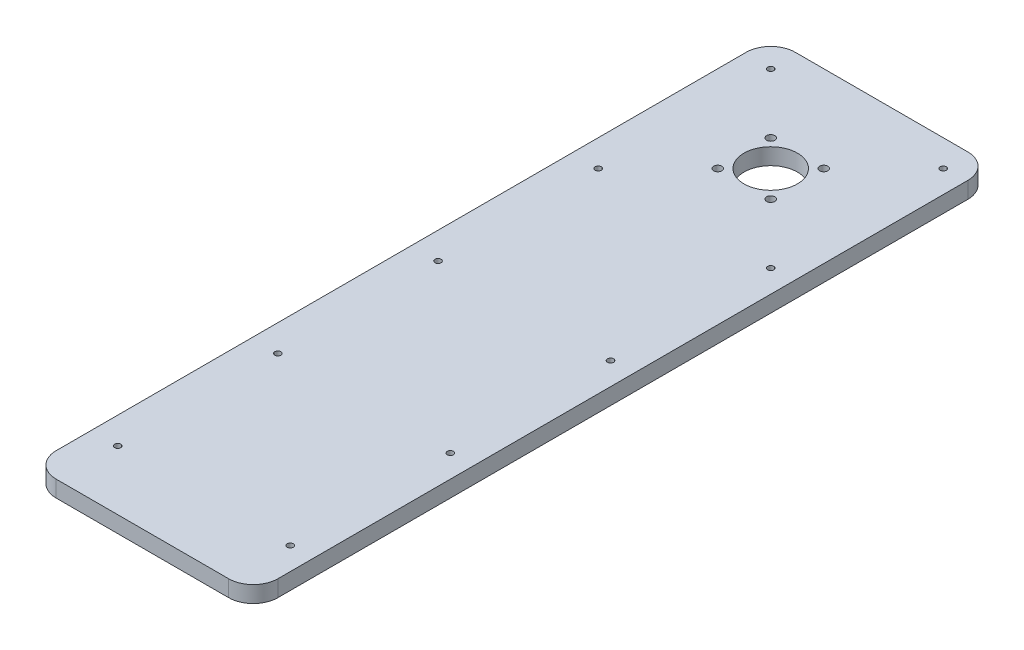
ISO-10303-21;
HEADER;
FILE_DESCRIPTION(('STEP AP214'),'2;1');
FILE_NAME('part.step','',(''),(''),'','','');
FILE_SCHEMA(('AUTOMOTIVE_DESIGN { 1 0 10303 214 1 1 1 1 }'));
ENDSEC;
DATA;
#1=APPLICATION_CONTEXT('core data for automotive mechanical design processes');
#2=APPLICATION_PROTOCOL_DEFINITION('international standard','automotive_design',2000,#1);
#3=PRODUCT_CONTEXT('',#1,'mechanical');
#4=PRODUCT('Part','Part','',(#3));
#5=PRODUCT_RELATED_PRODUCT_CATEGORY('part','',(#4));
#6=PRODUCT_DEFINITION_FORMATION('','',#4);
#7=PRODUCT_DEFINITION_CONTEXT('part definition',#1,'design');
#8=PRODUCT_DEFINITION('design','',#6,#7);
#9=PRODUCT_DEFINITION_SHAPE('','',#8);
#10=(LENGTH_UNIT() NAMED_UNIT(*) SI_UNIT(.MILLI.,.METRE.));
#11=(NAMED_UNIT(*) PLANE_ANGLE_UNIT() SI_UNIT($,.RADIAN.));
#12=(NAMED_UNIT(*) SI_UNIT($,.STERADIAN.) SOLID_ANGLE_UNIT());
#13=UNCERTAINTY_MEASURE_WITH_UNIT(LENGTH_MEASURE(1.E-05),#10,'distance_accuracy_value','');
#14=(GEOMETRIC_REPRESENTATION_CONTEXT(3) GLOBAL_UNCERTAINTY_ASSIGNED_CONTEXT((#13)) GLOBAL_UNIT_ASSIGNED_CONTEXT((#10,
#11,#12)) REPRESENTATION_CONTEXT('',''));
#15=CARTESIAN_POINT('',(0.,0.,0.));
#16=DIRECTION('',(0.,0.,1.));
#17=DIRECTION('',(1.,0.,0.));
#18=AXIS2_PLACEMENT_3D('',#15,#16,#17);
#19=CARTESIAN_POINT('',(0.,8.,0.));
#20=DIRECTION('',(0.,-1.,0.));
#21=DIRECTION('',(0.,0.,-1.));
#22=AXIS2_PLACEMENT_3D('',#19,#20,#21);
#23=PLANE('',#22);
#24=DIRECTION('',(0.,0.,-1.));
#25=VECTOR('',#24,1.);
#26=CARTESIAN_POINT('',(53.,8.,180.));
#27=LINE('',#26,#25);
#28=CARTESIAN_POINT('',(53.,8.,168.));
#29=VERTEX_POINT('',#28);
#30=CARTESIAN_POINT('',(53.,8.,-168.));
#31=VERTEX_POINT('',#30);
#32=EDGE_CURVE('E140',#29,#31,#27,.T.);
#33=ORIENTED_EDGE('',*,*,#32,.T.);
#34=CARTESIAN_POINT('',(41.,8.,-168.));
#35=DIRECTION('',(0.,-1.,0.));
#36=DIRECTION('',(0.,0.,-1.));
#37=AXIS2_PLACEMENT_3D('',#34,#35,#36);
#38=CIRCLE('',#37,12.);
#39=CARTESIAN_POINT('',(41.,8.,-180.));
#40=VERTEX_POINT('',#39);
#41=EDGE_CURVE('E155',#31,#40,#38,.F.);
#42=ORIENTED_EDGE('',*,*,#41,.T.);
#43=DIRECTION('',(-1.,0.,0.));
#44=VECTOR('',#43,1.);
#45=CARTESIAN_POINT('',(-55.,8.,-180.));
#46=LINE('',#45,#44);
#47=CARTESIAN_POINT('',(-43.,8.,-180.));
#48=VERTEX_POINT('',#47);
#49=EDGE_CURVE('E122',#40,#48,#46,.T.);
#50=ORIENTED_EDGE('',*,*,#49,.T.);
#51=CARTESIAN_POINT('',(-43.,8.,-168.));
#52=DIRECTION('',(0.,-1.,0.));
#53=DIRECTION('',(0.,0.,-1.));
#54=AXIS2_PLACEMENT_3D('',#51,#52,#53);
#55=CIRCLE('',#54,12.);
#56=CARTESIAN_POINT('',(-55.,8.,-168.));
#57=VERTEX_POINT('',#56);
#58=EDGE_CURVE('E153',#48,#57,#55,.F.);
#59=ORIENTED_EDGE('',*,*,#58,.T.);
#60=DIRECTION('',(0.,0.,1.));
#61=VECTOR('',#60,1.);
#62=CARTESIAN_POINT('',(-55.,8.,180.));
#63=LINE('',#62,#61);
#64=CARTESIAN_POINT('',(-55.,8.,168.));
#65=VERTEX_POINT('',#64);
#66=EDGE_CURVE('E175',#57,#65,#63,.T.);
#67=ORIENTED_EDGE('',*,*,#66,.T.);
#68=CARTESIAN_POINT('',(-43.,8.,168.));
#69=DIRECTION('',(0.,-1.,0.));
#70=DIRECTION('',(0.,0.,-1.));
#71=AXIS2_PLACEMENT_3D('',#68,#69,#70);
#72=CIRCLE('',#71,12.);
#73=CARTESIAN_POINT('',(-43.,8.,180.));
#74=VERTEX_POINT('',#73);
#75=EDGE_CURVE('E57',#65,#74,#72,.F.);
#76=ORIENTED_EDGE('',*,*,#75,.T.);
#77=DIRECTION('',(1.,0.,0.));
#78=VECTOR('',#77,1.);
#79=CARTESIAN_POINT('',(-55.,8.,180.));
#80=LINE('',#79,#78);
#81=CARTESIAN_POINT('',(41.,8.,180.));
#82=VERTEX_POINT('',#81);
#83=EDGE_CURVE('E141',#74,#82,#80,.T.);
#84=ORIENTED_EDGE('',*,*,#83,.T.);
#85=CARTESIAN_POINT('',(41.,8.,168.));
#86=DIRECTION('',(0.,-1.,0.));
#87=DIRECTION('',(0.,0.,-1.));
#88=AXIS2_PLACEMENT_3D('',#85,#86,#87);
#89=CIRCLE('',#88,12.);
#90=EDGE_CURVE('E151',#82,#29,#89,.F.);
#91=ORIENTED_EDGE('',*,*,#90,.T.);
#92=EDGE_LOOP('',(#33,#42,#50,#59,#67,#76,#84,#91));
#93=FACE_BOUND('',#92,.T.);
#94=CARTESIAN_POINT('',(0.,8.,-125.));
#95=DIRECTION('',(0.,1.,0.));
#96=DIRECTION('',(0.,0.,1.));
#97=AXIS2_PLACEMENT_3D('',#94,#95,#96);
#98=CIRCLE('',#97,13.);
#99=CARTESIAN_POINT('',(0.,8.,-112.));
#100=VERTEX_POINT('',#99);
#101=EDGE_CURVE('E135',#100,#100,#98,.T.);
#102=ORIENTED_EDGE('',*,*,#101,.F.);
#103=EDGE_LOOP('',(#102));
#104=FACE_BOUND('',#103,.T.);
#105=CARTESIAN_POINT('',(-41.9999999999999,8.,-4.99999999999999));
#106=DIRECTION('',(0.,1.,0.));
#107=DIRECTION('',(0.,0.,1.));
#108=AXIS2_PLACEMENT_3D('',#105,#106,#107);
#109=CIRCLE('',#108,1.5);
#110=CARTESIAN_POINT('',(-41.9999999999999,8.,-3.49999999999999));
#111=VERTEX_POINT('',#110);
#112=EDGE_CURVE('E190',#111,#111,#109,.T.);
#113=ORIENTED_EDGE('',*,*,#112,.F.);
#114=EDGE_LOOP('',(#113));
#115=FACE_BOUND('',#114,.T.);
#116=CARTESIAN_POINT('',(-41.9999999999999,8.,73.));
#117=DIRECTION('',(0.,1.,0.));
#118=DIRECTION('',(0.,0.,1.));
#119=AXIS2_PLACEMENT_3D('',#116,#117,#118);
#120=CIRCLE('',#119,1.5);
#121=CARTESIAN_POINT('',(-41.9999999999999,8.,74.5));
#122=VERTEX_POINT('',#121);
#123=EDGE_CURVE('E194',#122,#122,#120,.T.);
#124=ORIENTED_EDGE('',*,*,#123,.F.);
#125=EDGE_LOOP('',(#124));
#126=FACE_BOUND('',#125,.T.);
#127=CARTESIAN_POINT('',(-41.9999999999999,8.,151.));
#128=DIRECTION('',(0.,1.,0.));
#129=DIRECTION('',(0.,0.,1.));
#130=AXIS2_PLACEMENT_3D('',#127,#128,#129);
#131=CIRCLE('',#130,1.5);
#132=CARTESIAN_POINT('',(-41.9999999999999,8.,152.5));
#133=VERTEX_POINT('',#132);
#134=EDGE_CURVE('E198',#133,#133,#131,.T.);
#135=ORIENTED_EDGE('',*,*,#134,.F.);
#136=EDGE_LOOP('',(#135));
#137=FACE_BOUND('',#136,.T.);
#138=CARTESIAN_POINT('',(-42.,8.,-83.));
#139=DIRECTION('',(0.,1.,0.));
#140=DIRECTION('',(0.,0.,1.));
#141=AXIS2_PLACEMENT_3D('',#138,#139,#140);
#142=CIRCLE('',#141,1.5);
#143=CARTESIAN_POINT('',(-42.,8.,-81.5));
#144=VERTEX_POINT('',#143);
#145=EDGE_CURVE('E202',#144,#144,#142,.T.);
#146=ORIENTED_EDGE('',*,*,#145,.F.);
#147=EDGE_LOOP('',(#146));
#148=FACE_BOUND('',#147,.T.);
#149=CARTESIAN_POINT('',(-12.9046987566544,8.,-112.095301243345));
#150=DIRECTION('',(0.,1.,0.));
#151=DIRECTION('',(0.,0.,1.));
#152=AXIS2_PLACEMENT_3D('',#149,#150,#151);
#153=CIRCLE('',#152,2.);
#154=CARTESIAN_POINT('',(-12.9046987566544,8.,-110.095301243345));
#155=VERTEX_POINT('',#154);
#156=EDGE_CURVE('E206',#155,#155,#153,.T.);
#157=ORIENTED_EDGE('',*,*,#156,.F.);
#158=EDGE_LOOP('',(#157));
#159=FACE_BOUND('',#158,.T.);
#160=CARTESIAN_POINT('',(-42.,8.,-167.));
#161=DIRECTION('',(0.,1.,0.));
#162=DIRECTION('',(0.,0.,1.));
#163=AXIS2_PLACEMENT_3D('',#160,#161,#162);
#164=CIRCLE('',#163,1.5);
#165=CARTESIAN_POINT('',(-42.,8.,-165.5));
#166=VERTEX_POINT('',#165);
#167=EDGE_CURVE('E210',#166,#166,#164,.T.);
#168=ORIENTED_EDGE('',*,*,#167,.F.);
#169=EDGE_LOOP('',(#168));
#170=FACE_BOUND('',#169,.T.);
#171=CARTESIAN_POINT('',(42.,8.,-167.));
#172=DIRECTION('',(0.,1.,0.));
#173=DIRECTION('',(0.,0.,1.));
#174=AXIS2_PLACEMENT_3D('',#171,#172,#173);
#175=CIRCLE('',#174,1.5);
#176=CARTESIAN_POINT('',(42.,8.,-165.5));
#177=VERTEX_POINT('',#176);
#178=EDGE_CURVE('E214',#177,#177,#175,.T.);
#179=ORIENTED_EDGE('',*,*,#178,.F.);
#180=EDGE_LOOP('',(#179));
#181=FACE_BOUND('',#180,.T.);
#182=CARTESIAN_POINT('',(42.,8.,-83.));
#183=DIRECTION('',(0.,1.,0.));
#184=DIRECTION('',(0.,0.,1.));
#185=AXIS2_PLACEMENT_3D('',#182,#183,#184);
#186=CIRCLE('',#185,1.5);
#187=CARTESIAN_POINT('',(42.,8.,-81.5));
#188=VERTEX_POINT('',#187);
#189=EDGE_CURVE('E218',#188,#188,#186,.T.);
#190=ORIENTED_EDGE('',*,*,#189,.F.);
#191=EDGE_LOOP('',(#190));
#192=FACE_BOUND('',#191,.T.);
#193=CARTESIAN_POINT('',(42.,8.,151.));
#194=DIRECTION('',(0.,1.,0.));
#195=DIRECTION('',(0.,0.,-1.));
#196=AXIS2_PLACEMENT_3D('',#193,#194,#195);
#197=CIRCLE('',#196,1.5);
#198=CARTESIAN_POINT('',(42.,8.,149.5));
#199=VERTEX_POINT('',#198);
#200=EDGE_CURVE('E222',#199,#199,#197,.T.);
#201=ORIENTED_EDGE('',*,*,#200,.F.);
#202=EDGE_LOOP('',(#201));
#203=FACE_BOUND('',#202,.T.);
#204=CARTESIAN_POINT('',(-12.9046987566546,8.,-137.904698756654));
#205=DIRECTION('',(0.,1.,0.));
#206=DIRECTION('',(0.,0.,1.));
#207=AXIS2_PLACEMENT_3D('',#204,#205,#206);
#208=CIRCLE('',#207,2.00000000000001);
#209=CARTESIAN_POINT('',(-12.9046987566546,8.,-135.904698756654));
#210=VERTEX_POINT('',#209);
#211=EDGE_CURVE('E226',#210,#210,#208,.T.);
#212=ORIENTED_EDGE('',*,*,#211,.F.);
#213=EDGE_LOOP('',(#212));
#214=FACE_BOUND('',#213,.T.);
#215=CARTESIAN_POINT('',(12.9046987566544,8.,-137.904698756655));
#216=DIRECTION('',(0.,1.,0.));
#217=DIRECTION('',(0.,0.,1.));
#218=AXIS2_PLACEMENT_3D('',#215,#216,#217);
#219=CIRCLE('',#218,2.);
#220=CARTESIAN_POINT('',(12.9046987566544,8.,-135.904698756655));
#221=VERTEX_POINT('',#220);
#222=EDGE_CURVE('E230',#221,#221,#219,.T.);
#223=ORIENTED_EDGE('',*,*,#222,.F.);
#224=EDGE_LOOP('',(#223));
#225=FACE_BOUND('',#224,.T.);
#226=CARTESIAN_POINT('',(12.9046987566546,8.,-112.095301243346));
#227=DIRECTION('',(0.,1.,0.));
#228=DIRECTION('',(0.,0.,1.));
#229=AXIS2_PLACEMENT_3D('',#226,#227,#228);
#230=CIRCLE('',#229,2.00000000000001);
#231=CARTESIAN_POINT('',(12.9046987566546,8.,-110.095301243346));
#232=VERTEX_POINT('',#231);
#233=EDGE_CURVE('E234',#232,#232,#230,.T.);
#234=ORIENTED_EDGE('',*,*,#233,.F.);
#235=EDGE_LOOP('',(#234));
#236=FACE_BOUND('',#235,.T.);
#237=CARTESIAN_POINT('',(42.,8.,72.9999999999998));
#238=DIRECTION('',(0.,1.,0.));
#239=DIRECTION('',(0.,0.,-1.));
#240=AXIS2_PLACEMENT_3D('',#237,#238,#239);
#241=CIRCLE('',#240,1.5);
#242=CARTESIAN_POINT('',(42.,8.,71.4999999999998));
#243=VERTEX_POINT('',#242);
#244=EDGE_CURVE('E238',#243,#243,#241,.T.);
#245=ORIENTED_EDGE('',*,*,#244,.F.);
#246=EDGE_LOOP('',(#245));
#247=FACE_BOUND('',#246,.T.);
#248=CARTESIAN_POINT('',(42.,8.,-5.0000000000001));
#249=DIRECTION('',(0.,1.,0.));
#250=DIRECTION('',(0.,0.,-1.));
#251=AXIS2_PLACEMENT_3D('',#248,#249,#250);
#252=CIRCLE('',#251,1.5);
#253=CARTESIAN_POINT('',(42.,8.,-6.50000000000011));
#254=VERTEX_POINT('',#253);
#255=EDGE_CURVE('E241',#254,#254,#252,.T.);
#256=ORIENTED_EDGE('',*,*,#255,.F.);
#257=EDGE_LOOP('',(#256));
#258=FACE_BOUND('',#257,.T.);
#259=ADVANCED_FACE('F37',(#93,#104,#115,#126,#137,#148,#159,#170,#181,#192,#203,#214,#225,#236,
#247,#258),#23,.F.);
#260=CARTESIAN_POINT('',(0.,0.,0.));
#261=DIRECTION('',(0.,-1.,0.));
#262=DIRECTION('',(0.,0.,-1.));
#263=AXIS2_PLACEMENT_3D('',#260,#261,#262);
#264=PLANE('',#263);
#265=CARTESIAN_POINT('',(42.,0.,72.9999999999998));
#266=DIRECTION('',(0.,1.,0.));
#267=DIRECTION('',(0.,0.,-1.));
#268=AXIS2_PLACEMENT_3D('',#265,#266,#267);
#269=CIRCLE('',#268,1.5);
#270=CARTESIAN_POINT('',(42.,0.,71.4999999999998));
#271=VERTEX_POINT('',#270);
#272=EDGE_CURVE('E243',#271,#271,#269,.T.);
#273=ORIENTED_EDGE('',*,*,#272,.T.);
#274=EDGE_LOOP('',(#273));
#275=FACE_BOUND('',#274,.T.);
#276=CARTESIAN_POINT('',(12.9046987566544,0.,-137.904698756655));
#277=DIRECTION('',(0.,1.,0.));
#278=DIRECTION('',(0.,0.,1.));
#279=AXIS2_PLACEMENT_3D('',#276,#277,#278);
#280=CIRCLE('',#279,2.);
#281=CARTESIAN_POINT('',(12.9046987566544,0.,-135.904698756655));
#282=VERTEX_POINT('',#281);
#283=EDGE_CURVE('E254',#282,#282,#280,.T.);
#284=ORIENTED_EDGE('',*,*,#283,.T.);
#285=EDGE_LOOP('',(#284));
#286=FACE_BOUND('',#285,.T.);
#287=CARTESIAN_POINT('',(42.,0.,151.));
#288=DIRECTION('',(0.,1.,0.));
#289=DIRECTION('',(0.,0.,-1.));
#290=AXIS2_PLACEMENT_3D('',#287,#288,#289);
#291=CIRCLE('',#290,1.5);
#292=CARTESIAN_POINT('',(42.,0.,149.5));
#293=VERTEX_POINT('',#292);
#294=EDGE_CURVE('E262',#293,#293,#291,.T.);
#295=ORIENTED_EDGE('',*,*,#294,.T.);
#296=EDGE_LOOP('',(#295));
#297=FACE_BOUND('',#296,.T.);
#298=CARTESIAN_POINT('',(42.,0.,-167.));
#299=DIRECTION('',(0.,1.,0.));
#300=DIRECTION('',(0.,0.,1.));
#301=AXIS2_PLACEMENT_3D('',#298,#299,#300);
#302=CIRCLE('',#301,1.5);
#303=CARTESIAN_POINT('',(42.,0.,-165.5));
#304=VERTEX_POINT('',#303);
#305=EDGE_CURVE('E270',#304,#304,#302,.T.);
#306=ORIENTED_EDGE('',*,*,#305,.T.);
#307=EDGE_LOOP('',(#306));
#308=FACE_BOUND('',#307,.T.);
#309=CARTESIAN_POINT('',(-12.9046987566544,0.,-112.095301243345));
#310=DIRECTION('',(0.,1.,0.));
#311=DIRECTION('',(0.,0.,1.));
#312=AXIS2_PLACEMENT_3D('',#309,#310,#311);
#313=CIRCLE('',#312,2.);
#314=CARTESIAN_POINT('',(-12.9046987566544,0.,-110.095301243345));
#315=VERTEX_POINT('',#314);
#316=EDGE_CURVE('E278',#315,#315,#313,.T.);
#317=ORIENTED_EDGE('',*,*,#316,.T.);
#318=EDGE_LOOP('',(#317));
#319=FACE_BOUND('',#318,.T.);
#320=CARTESIAN_POINT('',(-41.9999999999999,0.,151.));
#321=DIRECTION('',(0.,1.,0.));
#322=DIRECTION('',(0.,0.,1.));
#323=AXIS2_PLACEMENT_3D('',#320,#321,#322);
#324=CIRCLE('',#323,1.5);
#325=CARTESIAN_POINT('',(-41.9999999999999,0.,152.5));
#326=VERTEX_POINT('',#325);
#327=EDGE_CURVE('E286',#326,#326,#324,.T.);
#328=ORIENTED_EDGE('',*,*,#327,.T.);
#329=EDGE_LOOP('',(#328));
#330=FACE_BOUND('',#329,.T.);
#331=CARTESIAN_POINT('',(-41.9999999999999,0.,-4.99999999999999));
#332=DIRECTION('',(0.,1.,0.));
#333=DIRECTION('',(0.,0.,1.));
#334=AXIS2_PLACEMENT_3D('',#331,#332,#333);
#335=CIRCLE('',#334,1.5);
#336=CARTESIAN_POINT('',(-41.9999999999999,0.,-3.49999999999999));
#337=VERTEX_POINT('',#336);
#338=EDGE_CURVE('E294',#337,#337,#335,.T.);
#339=ORIENTED_EDGE('',*,*,#338,.T.);
#340=EDGE_LOOP('',(#339));
#341=FACE_BOUND('',#340,.T.);
#342=DIRECTION('',(-1.,0.,0.));
#343=VECTOR('',#342,1.);
#344=CARTESIAN_POINT('',(-55.,0.,-180.));
#345=LINE('',#344,#343);
#346=CARTESIAN_POINT('',(41.,0.,-180.));
#347=VERTEX_POINT('',#346);
#348=CARTESIAN_POINT('',(-43.,0.,-180.));
#349=VERTEX_POINT('',#348);
#350=EDGE_CURVE('E119',#347,#349,#345,.T.);
#351=ORIENTED_EDGE('',*,*,#350,.F.);
#352=CARTESIAN_POINT('',(41.,0.,-168.));
#353=DIRECTION('',(0.,-1.,0.));
#354=DIRECTION('',(0.,0.,-1.));
#355=AXIS2_PLACEMENT_3D('',#352,#353,#354);
#356=CIRCLE('',#355,12.);
#357=CARTESIAN_POINT('',(53.,0.,-168.));
#358=VERTEX_POINT('',#357);
#359=EDGE_CURVE('E102',#347,#358,#356,.T.);
#360=ORIENTED_EDGE('',*,*,#359,.T.);
#361=DIRECTION('',(0.,0.,-1.));
#362=VECTOR('',#361,1.);
#363=CARTESIAN_POINT('',(53.,0.,180.));
#364=LINE('',#363,#362);
#365=CARTESIAN_POINT('',(53.,0.,168.));
#366=VERTEX_POINT('',#365);
#367=EDGE_CURVE('E130',#366,#358,#364,.T.);
#368=ORIENTED_EDGE('',*,*,#367,.F.);
#369=CARTESIAN_POINT('',(41.,0.,168.));
#370=DIRECTION('',(0.,-1.,0.));
#371=DIRECTION('',(0.,0.,-1.));
#372=AXIS2_PLACEMENT_3D('',#369,#370,#371);
#373=CIRCLE('',#372,12.);
#374=CARTESIAN_POINT('',(41.,0.,180.));
#375=VERTEX_POINT('',#374);
#376=EDGE_CURVE('E144',#366,#375,#373,.T.);
#377=ORIENTED_EDGE('',*,*,#376,.T.);
#378=DIRECTION('',(1.,0.,0.));
#379=VECTOR('',#378,1.);
#380=CARTESIAN_POINT('',(-55.,0.,180.));
#381=LINE('',#380,#379);
#382=CARTESIAN_POINT('',(-43.,0.,180.));
#383=VERTEX_POINT('',#382);
#384=EDGE_CURVE('E133',#383,#375,#381,.T.);
#385=ORIENTED_EDGE('',*,*,#384,.F.);
#386=CARTESIAN_POINT('',(-43.,0.,168.));
#387=DIRECTION('',(0.,-1.,0.));
#388=DIRECTION('',(0.,0.,-1.));
#389=AXIS2_PLACEMENT_3D('',#386,#387,#388);
#390=CIRCLE('',#389,12.);
#391=CARTESIAN_POINT('',(-55.,0.,168.));
#392=VERTEX_POINT('',#391);
#393=EDGE_CURVE('E123',#383,#392,#390,.T.);
#394=ORIENTED_EDGE('',*,*,#393,.T.);
#395=DIRECTION('',(0.,0.,1.));
#396=VECTOR('',#395,1.);
#397=CARTESIAN_POINT('',(-55.,0.,180.));
#398=LINE('',#397,#396);
#399=CARTESIAN_POINT('',(-55.,0.,-168.));
#400=VERTEX_POINT('',#399);
#401=EDGE_CURVE('E129',#400,#392,#398,.T.);
#402=ORIENTED_EDGE('',*,*,#401,.F.);
#403=CARTESIAN_POINT('',(-43.,0.,-168.));
#404=DIRECTION('',(0.,-1.,0.));
#405=DIRECTION('',(0.,0.,-1.));
#406=AXIS2_PLACEMENT_3D('',#403,#404,#405);
#407=CIRCLE('',#406,12.);
#408=EDGE_CURVE('E113',#400,#349,#407,.T.);
#409=ORIENTED_EDGE('',*,*,#408,.T.);
#410=EDGE_LOOP('',(#351,#360,#368,#377,#385,#394,#402,#409));
#411=FACE_BOUND('',#410,.T.);
#412=CARTESIAN_POINT('',(0.,0.,-125.));
#413=DIRECTION('',(0.,1.,0.));
#414=DIRECTION('',(0.,0.,1.));
#415=AXIS2_PLACEMENT_3D('',#412,#413,#414);
#416=CIRCLE('',#415,13.);
#417=CARTESIAN_POINT('',(0.,0.,-112.));
#418=VERTEX_POINT('',#417);
#419=EDGE_CURVE('E178',#418,#418,#416,.T.);
#420=ORIENTED_EDGE('',*,*,#419,.T.);
#421=EDGE_LOOP('',(#420));
#422=FACE_BOUND('',#421,.T.);
#423=CARTESIAN_POINT('',(-41.9999999999999,0.,73.));
#424=DIRECTION('',(0.,1.,0.));
#425=DIRECTION('',(0.,0.,1.));
#426=AXIS2_PLACEMENT_3D('',#423,#424,#425);
#427=CIRCLE('',#426,1.5);
#428=CARTESIAN_POINT('',(-41.9999999999999,0.,74.5));
#429=VERTEX_POINT('',#428);
#430=EDGE_CURVE('E290',#429,#429,#427,.T.);
#431=ORIENTED_EDGE('',*,*,#430,.T.);
#432=EDGE_LOOP('',(#431));
#433=FACE_BOUND('',#432,.T.);
#434=CARTESIAN_POINT('',(-42.,0.,-83.));
#435=DIRECTION('',(0.,1.,0.));
#436=DIRECTION('',(0.,0.,1.));
#437=AXIS2_PLACEMENT_3D('',#434,#435,#436);
#438=CIRCLE('',#437,1.5);
#439=CARTESIAN_POINT('',(-42.,0.,-81.5));
#440=VERTEX_POINT('',#439);
#441=EDGE_CURVE('E282',#440,#440,#438,.T.);
#442=ORIENTED_EDGE('',*,*,#441,.T.);
#443=EDGE_LOOP('',(#442));
#444=FACE_BOUND('',#443,.T.);
#445=CARTESIAN_POINT('',(-42.,0.,-167.));
#446=DIRECTION('',(0.,1.,0.));
#447=DIRECTION('',(0.,0.,1.));
#448=AXIS2_PLACEMENT_3D('',#445,#446,#447);
#449=CIRCLE('',#448,1.5);
#450=CARTESIAN_POINT('',(-42.,0.,-165.5));
#451=VERTEX_POINT('',#450);
#452=EDGE_CURVE('E274',#451,#451,#449,.T.);
#453=ORIENTED_EDGE('',*,*,#452,.T.);
#454=EDGE_LOOP('',(#453));
#455=FACE_BOUND('',#454,.T.);
#456=CARTESIAN_POINT('',(42.,0.,-83.));
#457=DIRECTION('',(0.,1.,0.));
#458=DIRECTION('',(0.,0.,1.));
#459=AXIS2_PLACEMENT_3D('',#456,#457,#458);
#460=CIRCLE('',#459,1.5);
#461=CARTESIAN_POINT('',(42.,0.,-81.5));
#462=VERTEX_POINT('',#461);
#463=EDGE_CURVE('E266',#462,#462,#460,.T.);
#464=ORIENTED_EDGE('',*,*,#463,.T.);
#465=EDGE_LOOP('',(#464));
#466=FACE_BOUND('',#465,.T.);
#467=CARTESIAN_POINT('',(-12.9046987566546,0.,-137.904698756654));
#468=DIRECTION('',(0.,1.,0.));
#469=DIRECTION('',(0.,0.,1.));
#470=AXIS2_PLACEMENT_3D('',#467,#468,#469);
#471=CIRCLE('',#470,2.00000000000001);
#472=CARTESIAN_POINT('',(-12.9046987566546,0.,-135.904698756654));
#473=VERTEX_POINT('',#472);
#474=EDGE_CURVE('E258',#473,#473,#471,.T.);
#475=ORIENTED_EDGE('',*,*,#474,.T.);
#476=EDGE_LOOP('',(#475));
#477=FACE_BOUND('',#476,.T.);
#478=CARTESIAN_POINT('',(12.9046987566546,0.,-112.095301243346));
#479=DIRECTION('',(0.,1.,0.));
#480=DIRECTION('',(0.,0.,1.));
#481=AXIS2_PLACEMENT_3D('',#478,#479,#480);
#482=CIRCLE('',#481,2.00000000000001);
#483=CARTESIAN_POINT('',(12.9046987566546,0.,-110.095301243346));
#484=VERTEX_POINT('',#483);
#485=EDGE_CURVE('E251',#484,#484,#482,.T.);
#486=ORIENTED_EDGE('',*,*,#485,.T.);
#487=EDGE_LOOP('',(#486));
#488=FACE_BOUND('',#487,.T.);
#489=CARTESIAN_POINT('',(42.,0.,-5.0000000000001));
#490=DIRECTION('',(0.,1.,0.));
#491=DIRECTION('',(0.,0.,-1.));
#492=AXIS2_PLACEMENT_3D('',#489,#490,#491);
#493=CIRCLE('',#492,1.5);
#494=CARTESIAN_POINT('',(42.,0.,-6.50000000000011));
#495=VERTEX_POINT('',#494);
#496=EDGE_CURVE('E244',#495,#495,#493,.T.);
#497=ORIENTED_EDGE('',*,*,#496,.T.);
#498=EDGE_LOOP('',(#497));
#499=FACE_BOUND('',#498,.T.);
#500=ADVANCED_FACE('F126',(#275,#286,#297,#308,#319,#330,#341,#411,#422,#433,#444,#455,#466,
#477,#488,#499),#264,.T.);
#501=CARTESIAN_POINT('',(53.,8.,180.));
#502=DIRECTION('',(-1.,0.,0.));
#503=DIRECTION('',(0.,0.,1.));
#504=AXIS2_PLACEMENT_3D('',#501,#502,#503);
#505=PLANE('',#504);
#506=ORIENTED_EDGE('',*,*,#367,.T.);
#507=DIRECTION('',(0.,-1.,0.));
#508=VECTOR('',#507,1.);
#509=CARTESIAN_POINT('',(53.,8.,-168.));
#510=LINE('',#509,#508);
#511=EDGE_CURVE('E107',#358,#31,#510,.F.);
#512=ORIENTED_EDGE('',*,*,#511,.T.);
#513=ORIENTED_EDGE('',*,*,#32,.F.);
#514=DIRECTION('',(0.,-1.,0.));
#515=VECTOR('',#514,1.);
#516=CARTESIAN_POINT('',(53.,8.,168.));
#517=LINE('',#516,#515);
#518=EDGE_CURVE('E112',#29,#366,#517,.T.);
#519=ORIENTED_EDGE('',*,*,#518,.T.);
#520=EDGE_LOOP('',(#506,#512,#513,#519));
#521=FACE_BOUND('',#520,.T.);
#522=ADVANCED_FACE('F172',(#521),#505,.F.);
#523=CARTESIAN_POINT('',(-55.,8.,-180.));
#524=DIRECTION('',(0.,0.,1.));
#525=DIRECTION('',(1.,0.,0.));
#526=AXIS2_PLACEMENT_3D('',#523,#524,#525);
#527=PLANE('',#526);
#528=ORIENTED_EDGE('',*,*,#49,.F.);
#529=DIRECTION('',(0.,-1.,0.));
#530=VECTOR('',#529,1.);
#531=CARTESIAN_POINT('',(41.,8.,-180.));
#532=LINE('',#531,#530);
#533=EDGE_CURVE('E106',#40,#347,#532,.T.);
#534=ORIENTED_EDGE('',*,*,#533,.T.);
#535=ORIENTED_EDGE('',*,*,#350,.T.);
#536=DIRECTION('',(0.,-1.,0.));
#537=VECTOR('',#536,1.);
#538=CARTESIAN_POINT('',(-43.,8.,-180.));
#539=LINE('',#538,#537);
#540=EDGE_CURVE('E124',#349,#48,#539,.F.);
#541=ORIENTED_EDGE('',*,*,#540,.T.);
#542=EDGE_LOOP('',(#528,#534,#535,#541));
#543=FACE_BOUND('',#542,.T.);
#544=ADVANCED_FACE('F118',(#543),#527,.F.);
#545=CARTESIAN_POINT('',(-55.,8.,180.));
#546=DIRECTION('',(1.,0.,0.));
#547=DIRECTION('',(0.,0.,-1.));
#548=AXIS2_PLACEMENT_3D('',#545,#546,#547);
#549=PLANE('',#548);
#550=ORIENTED_EDGE('',*,*,#66,.F.);
#551=DIRECTION('',(0.,-1.,0.));
#552=VECTOR('',#551,1.);
#553=CARTESIAN_POINT('',(-55.,8.,-168.));
#554=LINE('',#553,#552);
#555=EDGE_CURVE('E159',#57,#400,#554,.T.);
#556=ORIENTED_EDGE('',*,*,#555,.T.);
#557=ORIENTED_EDGE('',*,*,#401,.T.);
#558=DIRECTION('',(0.,-1.,0.));
#559=VECTOR('',#558,1.);
#560=CARTESIAN_POINT('',(-55.,8.,168.));
#561=LINE('',#560,#559);
#562=EDGE_CURVE('E157',#392,#65,#561,.F.);
#563=ORIENTED_EDGE('',*,*,#562,.T.);
#564=EDGE_LOOP('',(#550,#556,#557,#563));
#565=FACE_BOUND('',#564,.T.);
#566=ADVANCED_FACE('F315',(#565),#549,.F.);
#567=CARTESIAN_POINT('',(-55.,8.,180.));
#568=DIRECTION('',(0.,0.,-1.));
#569=DIRECTION('',(-1.,0.,0.));
#570=AXIS2_PLACEMENT_3D('',#567,#568,#569);
#571=PLANE('',#570);
#572=ORIENTED_EDGE('',*,*,#384,.T.);
#573=DIRECTION('',(0.,-1.,0.));
#574=VECTOR('',#573,1.);
#575=CARTESIAN_POINT('',(41.,8.,180.));
#576=LINE('',#575,#574);
#577=EDGE_CURVE('E11',#375,#82,#576,.F.);
#578=ORIENTED_EDGE('',*,*,#577,.T.);
#579=ORIENTED_EDGE('',*,*,#83,.F.);
#580=DIRECTION('',(0.,-1.,0.));
#581=VECTOR('',#580,1.);
#582=CARTESIAN_POINT('',(-43.,8.,180.));
#583=LINE('',#582,#581);
#584=EDGE_CURVE('E45',#74,#383,#583,.T.);
#585=ORIENTED_EDGE('',*,*,#584,.T.);
#586=EDGE_LOOP('',(#572,#578,#579,#585));
#587=FACE_BOUND('',#586,.T.);
#588=ADVANCED_FACE('F164',(#587),#571,.F.);
#589=CARTESIAN_POINT('',(0.,8.,-125.));
#590=DIRECTION('',(0.,-1.,0.));
#591=DIRECTION('',(0.,0.,-1.));
#592=AXIS2_PLACEMENT_3D('',#589,#590,#591);
#593=CYLINDRICAL_SURFACE('',#592,13.);
#594=ORIENTED_EDGE('',*,*,#101,.T.);
#595=EDGE_LOOP('',(#594));
#596=FACE_BOUND('',#595,.T.);
#597=ORIENTED_EDGE('',*,*,#419,.F.);
#598=EDGE_LOOP('',(#597));
#599=FACE_BOUND('',#598,.T.);
#600=ADVANCED_FACE('F304',(#596,#599),#593,.F.);
#601=CARTESIAN_POINT('',(-41.9999999999999,8.,-4.99999999999999));
#602=DIRECTION('',(0.,-1.,0.));
#603=DIRECTION('',(0.,0.,-1.));
#604=AXIS2_PLACEMENT_3D('',#601,#602,#603);
#605=CYLINDRICAL_SURFACE('',#604,1.5);
#606=ORIENTED_EDGE('',*,*,#112,.T.);
#607=EDGE_LOOP('',(#606));
#608=FACE_BOUND('',#607,.T.);
#609=ORIENTED_EDGE('',*,*,#338,.F.);
#610=EDGE_LOOP('',(#609));
#611=FACE_BOUND('',#610,.T.);
#612=ADVANCED_FACE('F306',(#608,#611),#605,.F.);
#613=CARTESIAN_POINT('',(-41.9999999999999,8.,73.));
#614=DIRECTION('',(0.,-1.,0.));
#615=DIRECTION('',(0.,0.,-1.));
#616=AXIS2_PLACEMENT_3D('',#613,#614,#615);
#617=CYLINDRICAL_SURFACE('',#616,1.5);
#618=ORIENTED_EDGE('',*,*,#123,.T.);
#619=EDGE_LOOP('',(#618));
#620=FACE_BOUND('',#619,.T.);
#621=ORIENTED_EDGE('',*,*,#430,.F.);
#622=EDGE_LOOP('',(#621));
#623=FACE_BOUND('',#622,.T.);
#624=ADVANCED_FACE('F312',(#620,#623),#617,.F.);
#625=CARTESIAN_POINT('',(-41.9999999999999,8.,151.));
#626=DIRECTION('',(0.,-1.,0.));
#627=DIRECTION('',(0.,0.,-1.));
#628=AXIS2_PLACEMENT_3D('',#625,#626,#627);
#629=CYLINDRICAL_SURFACE('',#628,1.5);
#630=ORIENTED_EDGE('',*,*,#134,.T.);
#631=EDGE_LOOP('',(#630));
#632=FACE_BOUND('',#631,.T.);
#633=ORIENTED_EDGE('',*,*,#327,.F.);
#634=EDGE_LOOP('',(#633));
#635=FACE_BOUND('',#634,.T.);
#636=ADVANCED_FACE('F526',(#632,#635),#629,.F.);
#637=CARTESIAN_POINT('',(-42.,8.,-83.));
#638=DIRECTION('',(0.,-1.,0.));
#639=DIRECTION('',(0.,0.,-1.));
#640=AXIS2_PLACEMENT_3D('',#637,#638,#639);
#641=CYLINDRICAL_SURFACE('',#640,1.5);
#642=ORIENTED_EDGE('',*,*,#145,.T.);
#643=EDGE_LOOP('',(#642));
#644=FACE_BOUND('',#643,.T.);
#645=ORIENTED_EDGE('',*,*,#441,.F.);
#646=EDGE_LOOP('',(#645));
#647=FACE_BOUND('',#646,.T.);
#648=ADVANCED_FACE('F515',(#644,#647),#641,.F.);
#649=CARTESIAN_POINT('',(-12.9046987566544,8.,-112.095301243345));
#650=DIRECTION('',(0.,-1.,0.));
#651=DIRECTION('',(0.,0.,-1.));
#652=AXIS2_PLACEMENT_3D('',#649,#650,#651);
#653=CYLINDRICAL_SURFACE('',#652,2.);
#654=ORIENTED_EDGE('',*,*,#156,.T.);
#655=EDGE_LOOP('',(#654));
#656=FACE_BOUND('',#655,.T.);
#657=ORIENTED_EDGE('',*,*,#316,.F.);
#658=EDGE_LOOP('',(#657));
#659=FACE_BOUND('',#658,.T.);
#660=ADVANCED_FACE('F504',(#656,#659),#653,.F.);
#661=CARTESIAN_POINT('',(-42.,8.,-167.));
#662=DIRECTION('',(0.,-1.,0.));
#663=DIRECTION('',(0.,0.,-1.));
#664=AXIS2_PLACEMENT_3D('',#661,#662,#663);
#665=CYLINDRICAL_SURFACE('',#664,1.5);
#666=ORIENTED_EDGE('',*,*,#167,.T.);
#667=EDGE_LOOP('',(#666));
#668=FACE_BOUND('',#667,.T.);
#669=ORIENTED_EDGE('',*,*,#452,.F.);
#670=EDGE_LOOP('',(#669));
#671=FACE_BOUND('',#670,.T.);
#672=ADVANCED_FACE('F493',(#668,#671),#665,.F.);
#673=CARTESIAN_POINT('',(42.,8.,-167.));
#674=DIRECTION('',(0.,-1.,0.));
#675=DIRECTION('',(0.,0.,-1.));
#676=AXIS2_PLACEMENT_3D('',#673,#674,#675);
#677=CYLINDRICAL_SURFACE('',#676,1.5);
#678=ORIENTED_EDGE('',*,*,#178,.T.);
#679=EDGE_LOOP('',(#678));
#680=FACE_BOUND('',#679,.T.);
#681=ORIENTED_EDGE('',*,*,#305,.F.);
#682=EDGE_LOOP('',(#681));
#683=FACE_BOUND('',#682,.T.);
#684=ADVANCED_FACE('F482',(#680,#683),#677,.F.);
#685=CARTESIAN_POINT('',(42.,8.,-83.));
#686=DIRECTION('',(0.,-1.,0.));
#687=DIRECTION('',(0.,0.,-1.));
#688=AXIS2_PLACEMENT_3D('',#685,#686,#687);
#689=CYLINDRICAL_SURFACE('',#688,1.5);
#690=ORIENTED_EDGE('',*,*,#189,.T.);
#691=EDGE_LOOP('',(#690));
#692=FACE_BOUND('',#691,.T.);
#693=ORIENTED_EDGE('',*,*,#463,.F.);
#694=EDGE_LOOP('',(#693));
#695=FACE_BOUND('',#694,.T.);
#696=ADVANCED_FACE('F471',(#692,#695),#689,.F.);
#697=CARTESIAN_POINT('',(42.,8.,151.));
#698=DIRECTION('',(0.,-1.,0.));
#699=DIRECTION('',(0.,0.,-1.));
#700=AXIS2_PLACEMENT_3D('',#697,#698,#699);
#701=CYLINDRICAL_SURFACE('',#700,1.5);
#702=ORIENTED_EDGE('',*,*,#200,.T.);
#703=EDGE_LOOP('',(#702));
#704=FACE_BOUND('',#703,.T.);
#705=ORIENTED_EDGE('',*,*,#294,.F.);
#706=EDGE_LOOP('',(#705));
#707=FACE_BOUND('',#706,.T.);
#708=ADVANCED_FACE('F460',(#704,#707),#701,.F.);
#709=CARTESIAN_POINT('',(-12.9046987566546,8.,-137.904698756654));
#710=DIRECTION('',(0.,-1.,0.));
#711=DIRECTION('',(0.,0.,-1.));
#712=AXIS2_PLACEMENT_3D('',#709,#710,#711);
#713=CYLINDRICAL_SURFACE('',#712,2.00000000000001);
#714=ORIENTED_EDGE('',*,*,#211,.T.);
#715=EDGE_LOOP('',(#714));
#716=FACE_BOUND('',#715,.T.);
#717=ORIENTED_EDGE('',*,*,#474,.F.);
#718=EDGE_LOOP('',(#717));
#719=FACE_BOUND('',#718,.T.);
#720=ADVANCED_FACE('F449',(#716,#719),#713,.F.);
#721=CARTESIAN_POINT('',(12.9046987566544,8.,-137.904698756655));
#722=DIRECTION('',(0.,-1.,0.));
#723=DIRECTION('',(0.,0.,-1.));
#724=AXIS2_PLACEMENT_3D('',#721,#722,#723);
#725=CYLINDRICAL_SURFACE('',#724,2.);
#726=ORIENTED_EDGE('',*,*,#222,.T.);
#727=EDGE_LOOP('',(#726));
#728=FACE_BOUND('',#727,.T.);
#729=ORIENTED_EDGE('',*,*,#283,.F.);
#730=EDGE_LOOP('',(#729));
#731=FACE_BOUND('',#730,.T.);
#732=ADVANCED_FACE('F438',(#728,#731),#725,.F.);
#733=CARTESIAN_POINT('',(12.9046987566546,8.,-112.095301243346));
#734=DIRECTION('',(0.,-1.,0.));
#735=DIRECTION('',(0.,0.,-1.));
#736=AXIS2_PLACEMENT_3D('',#733,#734,#735);
#737=CYLINDRICAL_SURFACE('',#736,2.00000000000001);
#738=ORIENTED_EDGE('',*,*,#233,.T.);
#739=EDGE_LOOP('',(#738));
#740=FACE_BOUND('',#739,.T.);
#741=ORIENTED_EDGE('',*,*,#485,.F.);
#742=EDGE_LOOP('',(#741));
#743=FACE_BOUND('',#742,.T.);
#744=ADVANCED_FACE('F427',(#740,#743),#737,.F.);
#745=CARTESIAN_POINT('',(42.,8.,72.9999999999998));
#746=DIRECTION('',(0.,-1.,0.));
#747=DIRECTION('',(0.,0.,-1.));
#748=AXIS2_PLACEMENT_3D('',#745,#746,#747);
#749=CYLINDRICAL_SURFACE('',#748,1.5);
#750=ORIENTED_EDGE('',*,*,#244,.T.);
#751=EDGE_LOOP('',(#750));
#752=FACE_BOUND('',#751,.T.);
#753=ORIENTED_EDGE('',*,*,#272,.F.);
#754=EDGE_LOOP('',(#753));
#755=FACE_BOUND('',#754,.T.);
#756=ADVANCED_FACE('F417',(#752,#755),#749,.F.);
#757=CARTESIAN_POINT('',(42.,8.,-5.0000000000001));
#758=DIRECTION('',(0.,-1.,0.));
#759=DIRECTION('',(0.,0.,-1.));
#760=AXIS2_PLACEMENT_3D('',#757,#758,#759);
#761=CYLINDRICAL_SURFACE('',#760,1.5);
#762=ORIENTED_EDGE('',*,*,#255,.T.);
#763=EDGE_LOOP('',(#762));
#764=FACE_BOUND('',#763,.T.);
#765=ORIENTED_EDGE('',*,*,#496,.F.);
#766=EDGE_LOOP('',(#765));
#767=FACE_BOUND('',#766,.T.);
#768=ADVANCED_FACE('F332',(#764,#767),#761,.F.);
#769=CARTESIAN_POINT('',(41.,8.,-168.));
#770=DIRECTION('',(0.,-1.,0.));
#771=DIRECTION('',(0.,0.,-1.));
#772=AXIS2_PLACEMENT_3D('',#769,#770,#771);
#773=CYLINDRICAL_SURFACE('',#772,12.);
#774=ORIENTED_EDGE('',*,*,#41,.F.);
#775=ORIENTED_EDGE('',*,*,#511,.F.);
#776=ORIENTED_EDGE('',*,*,#359,.F.);
#777=ORIENTED_EDGE('',*,*,#533,.F.);
#778=EDGE_LOOP('',(#774,#775,#776,#777));
#779=FACE_BOUND('',#778,.T.);
#780=ADVANCED_FACE('F105',(#779),#773,.T.);
#781=CARTESIAN_POINT('',(-43.,8.,-168.));
#782=DIRECTION('',(0.,-1.,0.));
#783=DIRECTION('',(0.,0.,-1.));
#784=AXIS2_PLACEMENT_3D('',#781,#782,#783);
#785=CYLINDRICAL_SURFACE('',#784,12.);
#786=ORIENTED_EDGE('',*,*,#58,.F.);
#787=ORIENTED_EDGE('',*,*,#540,.F.);
#788=ORIENTED_EDGE('',*,*,#408,.F.);
#789=ORIENTED_EDGE('',*,*,#555,.F.);
#790=EDGE_LOOP('',(#786,#787,#788,#789));
#791=FACE_BOUND('',#790,.T.);
#792=ADVANCED_FACE('F331',(#791),#785,.T.);
#793=CARTESIAN_POINT('',(41.,8.,168.));
#794=DIRECTION('',(0.,-1.,0.));
#795=DIRECTION('',(0.,0.,-1.));
#796=AXIS2_PLACEMENT_3D('',#793,#794,#795);
#797=CYLINDRICAL_SURFACE('',#796,12.);
#798=ORIENTED_EDGE('',*,*,#90,.F.);
#799=ORIENTED_EDGE('',*,*,#577,.F.);
#800=ORIENTED_EDGE('',*,*,#376,.F.);
#801=ORIENTED_EDGE('',*,*,#518,.F.);
#802=EDGE_LOOP('',(#798,#799,#800,#801));
#803=FACE_BOUND('',#802,.T.);
#804=ADVANCED_FACE('F169',(#803),#797,.T.);
#805=CARTESIAN_POINT('',(-43.,8.,168.));
#806=DIRECTION('',(0.,-1.,0.));
#807=DIRECTION('',(0.,0.,-1.));
#808=AXIS2_PLACEMENT_3D('',#805,#806,#807);
#809=CYLINDRICAL_SURFACE('',#808,12.);
#810=ORIENTED_EDGE('',*,*,#75,.F.);
#811=ORIENTED_EDGE('',*,*,#562,.F.);
#812=ORIENTED_EDGE('',*,*,#393,.F.);
#813=ORIENTED_EDGE('',*,*,#584,.F.);
#814=EDGE_LOOP('',(#810,#811,#812,#813));
#815=FACE_BOUND('',#814,.T.);
#816=ADVANCED_FACE('F39',(#815),#809,.T.);
#817=CLOSED_SHELL('',(#259,#500,#522,#544,#566,#588,#600,#612,#624,#636,#648,#660,#672,#684,
#696,#708,#720,#732,#744,#756,#768,#780,#792,#804,#816));
#818=MANIFOLD_SOLID_BREP('B2',#817);
#819=ADVANCED_BREP_SHAPE_REPRESENTATION('',(#18,#818),#14);
#820=SHAPE_DEFINITION_REPRESENTATION(#9,#819);
ENDSEC;
END-ISO-10303-21;
